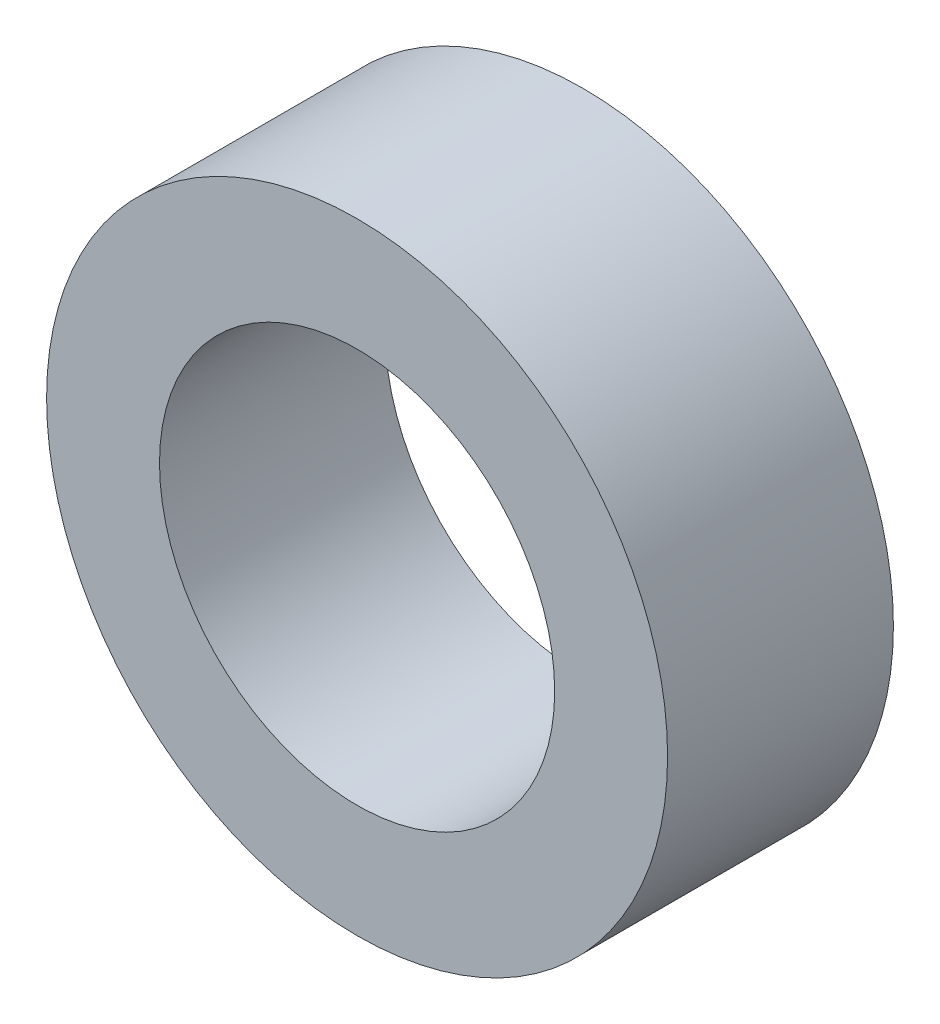
ISO-10303-21;
HEADER;
FILE_DESCRIPTION(('STEP AP214'),'2;1');
FILE_NAME('part.step','',(''),(''),'','','');
FILE_SCHEMA(('AUTOMOTIVE_DESIGN { 1 0 10303 214 1 1 1 1 }'));
ENDSEC;
DATA;
#1=APPLICATION_CONTEXT('core data for automotive mechanical design processes');
#2=APPLICATION_PROTOCOL_DEFINITION('international standard','automotive_design',2000,#1);
#3=PRODUCT_CONTEXT('',#1,'mechanical');
#4=PRODUCT('Part','Part','',(#3));
#5=PRODUCT_RELATED_PRODUCT_CATEGORY('part','',(#4));
#6=PRODUCT_DEFINITION_FORMATION('','',#4);
#7=PRODUCT_DEFINITION_CONTEXT('part definition',#1,'design');
#8=PRODUCT_DEFINITION('design','',#6,#7);
#9=PRODUCT_DEFINITION_SHAPE('','',#8);
#10=(LENGTH_UNIT() NAMED_UNIT(*) SI_UNIT(.MILLI.,.METRE.));
#11=(NAMED_UNIT(*) PLANE_ANGLE_UNIT() SI_UNIT($,.RADIAN.));
#12=(NAMED_UNIT(*) SI_UNIT($,.STERADIAN.) SOLID_ANGLE_UNIT());
#13=UNCERTAINTY_MEASURE_WITH_UNIT(LENGTH_MEASURE(1.E-05),#10,'distance_accuracy_value','');
#14=(GEOMETRIC_REPRESENTATION_CONTEXT(3) GLOBAL_UNCERTAINTY_ASSIGNED_CONTEXT((#13)) GLOBAL_UNIT_ASSIGNED_CONTEXT((#10,
#11,#12)) REPRESENTATION_CONTEXT('',''));
#15=CARTESIAN_POINT('',(0.,0.,0.));
#16=DIRECTION('',(0.,0.,1.));
#17=DIRECTION('',(1.,0.,0.));
#18=AXIS2_PLACEMENT_3D('',#15,#16,#17);
#19=CARTESIAN_POINT('',(0.,0.,2.));
#20=DIRECTION('',(0.,0.,1.));
#21=DIRECTION('',(1.,0.,0.));
#22=AXIS2_PLACEMENT_3D('',#19,#20,#21);
#23=PLANE('',#22);
#24=CARTESIAN_POINT('',(0.,0.,2.));
#25=DIRECTION('',(0.,0.,1.));
#26=DIRECTION('',(1.,0.,0.));
#27=AXIS2_PLACEMENT_3D('',#24,#25,#26);
#28=CIRCLE('',#27,2.75);
#29=CARTESIAN_POINT('',(2.75,0.,2.));
#30=VERTEX_POINT('',#29);
#31=EDGE_CURVE('E10',#30,#30,#28,.T.);
#32=ORIENTED_EDGE('',*,*,#31,.T.);
#33=EDGE_LOOP('',(#32));
#34=FACE_BOUND('',#33,.T.);
#35=CARTESIAN_POINT('',(0.,0.,2.));
#36=DIRECTION('',(0.,0.,1.));
#37=DIRECTION('',(1.,0.,0.));
#38=AXIS2_PLACEMENT_3D('',#35,#36,#37);
#39=CIRCLE('',#38,1.75);
#40=CARTESIAN_POINT('',(1.75,0.,2.));
#41=VERTEX_POINT('',#40);
#42=EDGE_CURVE('E56',#41,#41,#39,.T.);
#43=ORIENTED_EDGE('',*,*,#42,.F.);
#44=EDGE_LOOP('',(#43));
#45=FACE_BOUND('',#44,.T.);
#46=ADVANCED_FACE('F43',(#34,#45),#23,.T.);
#47=CARTESIAN_POINT('',(0.,0.,0.));
#48=DIRECTION('',(0.,0.,1.));
#49=DIRECTION('',(1.,0.,0.));
#50=AXIS2_PLACEMENT_3D('',#47,#48,#49);
#51=PLANE('',#50);
#52=CARTESIAN_POINT('',(0.,0.,0.));
#53=DIRECTION('',(0.,0.,1.));
#54=DIRECTION('',(1.,0.,0.));
#55=AXIS2_PLACEMENT_3D('',#52,#53,#54);
#56=CIRCLE('',#55,2.75);
#57=CARTESIAN_POINT('',(2.75,0.,0.));
#58=VERTEX_POINT('',#57);
#59=EDGE_CURVE('E47',#58,#58,#56,.T.);
#60=ORIENTED_EDGE('',*,*,#59,.F.);
#61=EDGE_LOOP('',(#60));
#62=FACE_BOUND('',#61,.T.);
#63=CARTESIAN_POINT('',(0.,0.,0.));
#64=DIRECTION('',(0.,0.,1.));
#65=DIRECTION('',(1.,0.,0.));
#66=AXIS2_PLACEMENT_3D('',#63,#64,#65);
#67=CIRCLE('',#66,1.75);
#68=CARTESIAN_POINT('',(1.75,0.,0.));
#69=VERTEX_POINT('',#68);
#70=EDGE_CURVE('E58',#69,#69,#67,.T.);
#71=ORIENTED_EDGE('',*,*,#70,.T.);
#72=EDGE_LOOP('',(#71));
#73=FACE_BOUND('',#72,.T.);
#74=ADVANCED_FACE('F70',(#62,#73),#51,.F.);
#75=CARTESIAN_POINT('',(0.,0.,2.));
#76=DIRECTION('',(0.,0.,-1.));
#77=DIRECTION('',(-1.,0.,0.));
#78=AXIS2_PLACEMENT_3D('',#75,#76,#77);
#79=CYLINDRICAL_SURFACE('',#78,2.75);
#80=ORIENTED_EDGE('',*,*,#31,.F.);
#81=EDGE_LOOP('',(#80));
#82=FACE_BOUND('',#81,.T.);
#83=ORIENTED_EDGE('',*,*,#59,.T.);
#84=EDGE_LOOP('',(#83));
#85=FACE_BOUND('',#84,.T.);
#86=ADVANCED_FACE('F45',(#82,#85),#79,.T.);
#87=CARTESIAN_POINT('',(0.,0.,2.));
#88=DIRECTION('',(0.,0.,-1.));
#89=DIRECTION('',(-1.,0.,0.));
#90=AXIS2_PLACEMENT_3D('',#87,#88,#89);
#91=CYLINDRICAL_SURFACE('',#90,1.75);
#92=ORIENTED_EDGE('',*,*,#42,.T.);
#93=EDGE_LOOP('',(#92));
#94=FACE_BOUND('',#93,.T.);
#95=ORIENTED_EDGE('',*,*,#70,.F.);
#96=EDGE_LOOP('',(#95));
#97=FACE_BOUND('',#96,.T.);
#98=ADVANCED_FACE('F66',(#94,#97),#91,.F.);
#99=CLOSED_SHELL('',(#46,#74,#86,#98));
#100=MANIFOLD_SOLID_BREP('B2',#99);
#101=ADVANCED_BREP_SHAPE_REPRESENTATION('',(#18,#100),#14);
#102=SHAPE_DEFINITION_REPRESENTATION(#9,#101);
ENDSEC;
END-ISO-10303-21;
